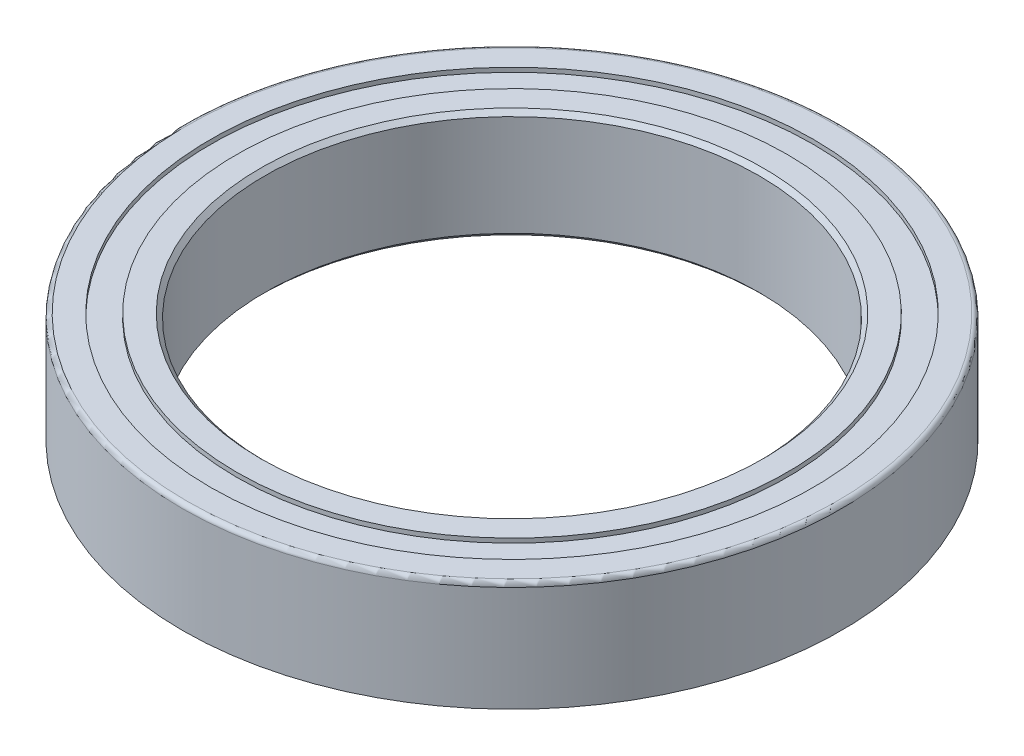
ISO-10303-21;
HEADER;
FILE_DESCRIPTION(('STEP AP214'),'2;1');
FILE_NAME('part.step','',(''),(''),'','','');
FILE_SCHEMA(('AUTOMOTIVE_DESIGN { 1 0 10303 214 1 1 1 1 }'));
ENDSEC;
DATA;
#1=APPLICATION_CONTEXT('core data for automotive mechanical design processes');
#2=APPLICATION_PROTOCOL_DEFINITION('international standard','automotive_design',2000,#1);
#3=PRODUCT_CONTEXT('',#1,'mechanical');
#4=PRODUCT('Part','Part','',(#3));
#5=PRODUCT_RELATED_PRODUCT_CATEGORY('part','',(#4));
#6=PRODUCT_DEFINITION_FORMATION('','',#4);
#7=PRODUCT_DEFINITION_CONTEXT('part definition',#1,'design');
#8=PRODUCT_DEFINITION('design','',#6,#7);
#9=PRODUCT_DEFINITION_SHAPE('','',#8);
#10=(LENGTH_UNIT() NAMED_UNIT(*) SI_UNIT(.MILLI.,.METRE.));
#11=(NAMED_UNIT(*) PLANE_ANGLE_UNIT() SI_UNIT($,.RADIAN.));
#12=(NAMED_UNIT(*) SI_UNIT($,.STERADIAN.) SOLID_ANGLE_UNIT());
#13=UNCERTAINTY_MEASURE_WITH_UNIT(LENGTH_MEASURE(1.E-05),#10,'distance_accuracy_value','');
#14=(GEOMETRIC_REPRESENTATION_CONTEXT(3) GLOBAL_UNCERTAINTY_ASSIGNED_CONTEXT((#13)) GLOBAL_UNIT_ASSIGNED_CONTEXT((#10,
#11,#12)) REPRESENTATION_CONTEXT('',''));
#15=CARTESIAN_POINT('',(0.,0.,0.));
#16=DIRECTION('',(0.,0.,1.));
#17=DIRECTION('',(1.,0.,0.));
#18=AXIS2_PLACEMENT_3D('',#15,#16,#17);
#19=CARTESIAN_POINT('',(0.,1.5875,0.));
#20=DIRECTION('',(0.,-1.,0.));
#21=DIRECTION('',(0.,0.,-1.));
#22=AXIS2_PLACEMENT_3D('',#19,#20,#21);
#23=CYLINDRICAL_SURFACE('',#22,8.7122);
#24=CARTESIAN_POINT('',(0.,-1.5875,0.));
#25=DIRECTION('',(0.,1.,0.));
#26=DIRECTION('',(0.,0.,1.));
#27=AXIS2_PLACEMENT_3D('',#24,#25,#26);
#28=CIRCLE('',#27,8.7122);
#29=CARTESIAN_POINT('',(0.,-1.5875,8.7122));
#30=VERTEX_POINT('',#29);
#31=EDGE_CURVE('E75',#30,#30,#28,.T.);
#32=ORIENTED_EDGE('',*,*,#31,.F.);
#33=EDGE_LOOP('',(#32));
#34=FACE_BOUND('',#33,.T.);
#35=CARTESIAN_POINT('',(0.,-1.4605,0.));
#36=DIRECTION('',(0.,1.,0.));
#37=DIRECTION('',(0.,0.,1.));
#38=AXIS2_PLACEMENT_3D('',#35,#36,#37);
#39=CIRCLE('',#38,8.7122);
#40=CARTESIAN_POINT('',(0.,-1.4605,8.7122));
#41=VERTEX_POINT('',#40);
#42=EDGE_CURVE('E78',#41,#41,#39,.T.);
#43=ORIENTED_EDGE('',*,*,#42,.T.);
#44=EDGE_LOOP('',(#43));
#45=FACE_BOUND('',#44,.T.);
#46=ADVANCED_FACE('F54',(#34,#45),#23,.F.);
#47=CARTESIAN_POINT('',(0.,1.4605,0.));
#48=DIRECTION('',(0.,1.,0.));
#49=DIRECTION('',(0.,0.,1.));
#50=AXIS2_PLACEMENT_3D('',#47,#48,#49);
#51=CIRCLE('',#50,8.7122);
#52=CARTESIAN_POINT('',(0.,1.4605,8.7122));
#53=VERTEX_POINT('',#52);
#54=EDGE_CURVE('E11',#53,#53,#51,.T.);
#55=ORIENTED_EDGE('',*,*,#54,.F.);
#56=EDGE_LOOP('',(#55));
#57=FACE_BOUND('',#56,.T.);
#58=CARTESIAN_POINT('',(0.,1.5875,0.));
#59=DIRECTION('',(0.,1.,0.));
#60=DIRECTION('',(0.,0.,1.));
#61=AXIS2_PLACEMENT_3D('',#58,#59,#60);
#62=CIRCLE('',#61,8.7122);
#63=CARTESIAN_POINT('',(0.,1.5875,8.7122));
#64=VERTEX_POINT('',#63);
#65=EDGE_CURVE('E69',#64,#64,#62,.T.);
#66=ORIENTED_EDGE('',*,*,#65,.T.);
#67=EDGE_LOOP('',(#66));
#68=FACE_BOUND('',#67,.T.);
#69=ADVANCED_FACE('F130',(#57,#68),#23,.F.);
#70=CARTESIAN_POINT('',(0.,1.5875,0.));
#71=DIRECTION('',(0.,-1.,0.));
#72=DIRECTION('',(0.,0.,-1.));
#73=AXIS2_PLACEMENT_3D('',#70,#71,#72);
#74=CYLINDRICAL_SURFACE('',#73,9.525);
#75=CARTESIAN_POINT('',(0.,1.4605,0.));
#76=DIRECTION('',(0.,1.,0.));
#77=DIRECTION('',(0.,0.,1.));
#78=AXIS2_PLACEMENT_3D('',#75,#76,#77);
#79=CIRCLE('',#78,9.525);
#80=CARTESIAN_POINT('',(0.,1.4605,9.525));
#81=VERTEX_POINT('',#80);
#82=EDGE_CURVE('E61',#81,#81,#79,.F.);
#83=ORIENTED_EDGE('',*,*,#82,.T.);
#84=EDGE_LOOP('',(#83));
#85=FACE_BOUND('',#84,.T.);
#86=CARTESIAN_POINT('',(0.,-1.5875,0.));
#87=DIRECTION('',(0.,1.,0.));
#88=DIRECTION('',(0.,0.,1.));
#89=AXIS2_PLACEMENT_3D('',#86,#87,#88);
#90=CIRCLE('',#89,9.525);
#91=CARTESIAN_POINT('',(0.,-1.5875,9.525));
#92=VERTEX_POINT('',#91);
#93=EDGE_CURVE('E72',#92,#92,#90,.T.);
#94=ORIENTED_EDGE('',*,*,#93,.T.);
#95=EDGE_LOOP('',(#94));
#96=FACE_BOUND('',#95,.T.);
#97=ADVANCED_FACE('F136',(#85,#96),#74,.T.);
#98=CARTESIAN_POINT('',(0.,1.5875,0.));
#99=DIRECTION('',(0.,1.,0.));
#100=DIRECTION('',(0.,0.,1.));
#101=AXIS2_PLACEMENT_3D('',#98,#99,#100);
#102=PLANE('',#101);
#103=CARTESIAN_POINT('',(0.,1.5875,0.));
#104=DIRECTION('',(0.,1.,0.));
#105=DIRECTION('',(0.,0.,1.));
#106=AXIS2_PLACEMENT_3D('',#103,#104,#105);
#107=CIRCLE('',#106,9.398);
#108=CARTESIAN_POINT('',(0.,1.5875,9.398));
#109=VERTEX_POINT('',#108);
#110=EDGE_CURVE('E65',#109,#109,#107,.T.);
#111=ORIENTED_EDGE('',*,*,#110,.T.);
#112=EDGE_LOOP('',(#111));
#113=FACE_BOUND('',#112,.T.);
#114=ORIENTED_EDGE('',*,*,#65,.F.);
#115=EDGE_LOOP('',(#114));
#116=FACE_BOUND('',#115,.T.);
#117=ADVANCED_FACE('F143',(#113,#116),#102,.T.);
#118=CARTESIAN_POINT('',(0.,-1.5875,0.));
#119=DIRECTION('',(0.,1.,0.));
#120=DIRECTION('',(0.,0.,1.));
#121=AXIS2_PLACEMENT_3D('',#118,#119,#120);
#122=PLANE('',#121);
#123=ORIENTED_EDGE('',*,*,#31,.T.);
#124=EDGE_LOOP('',(#123));
#125=FACE_BOUND('',#124,.T.);
#126=ORIENTED_EDGE('',*,*,#93,.F.);
#127=EDGE_LOOP('',(#126));
#128=FACE_BOUND('',#127,.T.);
#129=ADVANCED_FACE('F144',(#125,#128),#122,.F.);
#130=CARTESIAN_POINT('',(0.,1.4605,0.));
#131=DIRECTION('',(0.,1.,0.));
#132=DIRECTION('',(0.,0.,1.));
#133=AXIS2_PLACEMENT_3D('',#130,#131,#132);
#134=TOROIDAL_SURFACE('',#133,9.398,0.127);
#135=ORIENTED_EDGE('',*,*,#82,.F.);
#136=EDGE_LOOP('',(#135));
#137=FACE_BOUND('',#136,.T.);
#138=ORIENTED_EDGE('',*,*,#110,.F.);
#139=EDGE_LOOP('',(#138));
#140=FACE_BOUND('',#139,.T.);
#141=ADVANCED_FACE('F56',(#137,#140),#134,.T.);
#142=CARTESIAN_POINT('',(0.,1.4605,0.));
#143=DIRECTION('',(0.,1.,0.));
#144=DIRECTION('',(0.,0.,1.));
#145=AXIS2_PLACEMENT_3D('',#142,#143,#144);
#146=PLANE('',#145);
#147=ORIENTED_EDGE('',*,*,#54,.T.);
#148=EDGE_LOOP('',(#147));
#149=FACE_BOUND('',#148,.T.);
#150=CARTESIAN_POINT('',(0.,1.4605,0.));
#151=DIRECTION('',(0.,1.,0.));
#152=DIRECTION('',(0.,0.,1.));
#153=AXIS2_PLACEMENT_3D('',#150,#151,#152);
#154=CIRCLE('',#153,7.95655);
#155=CARTESIAN_POINT('',(0.,1.4605,7.95655));
#156=VERTEX_POINT('',#155);
#157=EDGE_CURVE('E83',#156,#156,#154,.T.);
#158=ORIENTED_EDGE('',*,*,#157,.F.);
#159=EDGE_LOOP('',(#158));
#160=FACE_BOUND('',#159,.T.);
#161=ADVANCED_FACE('F153',(#149,#160),#146,.T.);
#162=CARTESIAN_POINT('',(0.,-1.4605,0.));
#163=DIRECTION('',(0.,1.,0.));
#164=DIRECTION('',(0.,0.,1.));
#165=AXIS2_PLACEMENT_3D('',#162,#163,#164);
#166=PLANE('',#165);
#167=ORIENTED_EDGE('',*,*,#42,.F.);
#168=EDGE_LOOP('',(#167));
#169=FACE_BOUND('',#168,.T.);
#170=CARTESIAN_POINT('',(0.,-1.4605,0.));
#171=DIRECTION('',(0.,1.,0.));
#172=DIRECTION('',(0.,0.,1.));
#173=AXIS2_PLACEMENT_3D('',#170,#171,#172);
#174=CIRCLE('',#173,7.95655);
#175=CARTESIAN_POINT('',(0.,-1.4605,7.95655));
#176=VERTEX_POINT('',#175);
#177=EDGE_CURVE('E86',#176,#176,#174,.F.);
#178=ORIENTED_EDGE('',*,*,#177,.F.);
#179=EDGE_LOOP('',(#178));
#180=FACE_BOUND('',#179,.T.);
#181=ADVANCED_FACE('F127',(#169,#180),#166,.F.);
#182=CARTESIAN_POINT('',(0.,1.5875,0.));
#183=DIRECTION('',(0.,-1.,0.));
#184=DIRECTION('',(0.,0.,-1.));
#185=AXIS2_PLACEMENT_3D('',#182,#183,#184);
#186=CYLINDRICAL_SURFACE('',#185,7.95655);
#187=CARTESIAN_POINT('',(0.,-1.5875,0.));
#188=DIRECTION('',(0.,1.,0.));
#189=DIRECTION('',(0.,0.,1.));
#190=AXIS2_PLACEMENT_3D('',#187,#188,#189);
#191=CIRCLE('',#190,7.95655);
#192=CARTESIAN_POINT('',(0.,-1.5875,7.95655));
#193=VERTEX_POINT('',#192);
#194=EDGE_CURVE('E102',#193,#193,#191,.T.);
#195=ORIENTED_EDGE('',*,*,#194,.T.);
#196=EDGE_LOOP('',(#195));
#197=FACE_BOUND('',#196,.T.);
#198=ORIENTED_EDGE('',*,*,#177,.T.);
#199=EDGE_LOOP('',(#198));
#200=FACE_BOUND('',#199,.T.);
#201=ADVANCED_FACE('F115',(#197,#200),#186,.T.);
#202=CARTESIAN_POINT('',(0.,1.5875,0.));
#203=DIRECTION('',(0.,-1.,0.));
#204=DIRECTION('',(0.,0.,-1.));
#205=AXIS2_PLACEMENT_3D('',#202,#203,#204);
#206=CYLINDRICAL_SURFACE('',#205,7.14375);
#207=CARTESIAN_POINT('',(0.,-1.4605,0.));
#208=DIRECTION('',(0.,1.,0.));
#209=DIRECTION('',(0.,0.,1.));
#210=AXIS2_PLACEMENT_3D('',#207,#208,#209);
#211=CIRCLE('',#210,7.14375);
#212=CARTESIAN_POINT('',(0.,-1.4605,7.14375));
#213=VERTEX_POINT('',#212);
#214=EDGE_CURVE('E92',#213,#213,#211,.F.);
#215=ORIENTED_EDGE('',*,*,#214,.T.);
#216=EDGE_LOOP('',(#215));
#217=FACE_BOUND('',#216,.T.);
#218=CARTESIAN_POINT('',(0.,1.4605,0.));
#219=DIRECTION('',(0.,1.,0.));
#220=DIRECTION('',(0.,0.,1.));
#221=AXIS2_PLACEMENT_3D('',#218,#219,#220);
#222=CIRCLE('',#221,7.14375);
#223=CARTESIAN_POINT('',(0.,1.4605,7.14375));
#224=VERTEX_POINT('',#223);
#225=EDGE_CURVE('E95',#224,#224,#222,.T.);
#226=ORIENTED_EDGE('',*,*,#225,.T.);
#227=EDGE_LOOP('',(#226));
#228=FACE_BOUND('',#227,.T.);
#229=ADVANCED_FACE('F112',(#217,#228),#206,.F.);
#230=ORIENTED_EDGE('',*,*,#157,.T.);
#231=EDGE_LOOP('',(#230));
#232=FACE_BOUND('',#231,.T.);
#233=CARTESIAN_POINT('',(0.,1.5875,0.));
#234=DIRECTION('',(0.,1.,0.));
#235=DIRECTION('',(0.,0.,1.));
#236=AXIS2_PLACEMENT_3D('',#233,#234,#235);
#237=CIRCLE('',#236,7.95655);
#238=CARTESIAN_POINT('',(0.,1.5875,7.95655));
#239=VERTEX_POINT('',#238);
#240=EDGE_CURVE('E101',#239,#239,#237,.T.);
#241=ORIENTED_EDGE('',*,*,#240,.F.);
#242=EDGE_LOOP('',(#241));
#243=FACE_BOUND('',#242,.T.);
#244=ADVANCED_FACE('F110',(#232,#243),#186,.T.);
#245=CARTESIAN_POINT('',(0.,1.5875,0.));
#246=DIRECTION('',(0.,1.,0.));
#247=DIRECTION('',(0.,0.,1.));
#248=AXIS2_PLACEMENT_3D('',#245,#246,#247);
#249=PLANE('',#248);
#250=CARTESIAN_POINT('',(0.,1.5875,0.));
#251=DIRECTION('',(0.,1.,0.));
#252=DIRECTION('',(0.,0.,1.));
#253=AXIS2_PLACEMENT_3D('',#250,#251,#252);
#254=CIRCLE('',#253,7.27075);
#255=CARTESIAN_POINT('',(0.,1.5875,7.27075));
#256=VERTEX_POINT('',#255);
#257=EDGE_CURVE('E89',#256,#256,#254,.F.);
#258=ORIENTED_EDGE('',*,*,#257,.T.);
#259=EDGE_LOOP('',(#258));
#260=FACE_BOUND('',#259,.T.);
#261=ORIENTED_EDGE('',*,*,#240,.T.);
#262=EDGE_LOOP('',(#261));
#263=FACE_BOUND('',#262,.T.);
#264=ADVANCED_FACE('F108',(#260,#263),#249,.T.);
#265=CARTESIAN_POINT('',(0.,-1.5875,0.));
#266=DIRECTION('',(0.,1.,0.));
#267=DIRECTION('',(0.,0.,1.));
#268=AXIS2_PLACEMENT_3D('',#265,#266,#267);
#269=PLANE('',#268);
#270=CARTESIAN_POINT('',(0.,-1.5875,0.));
#271=DIRECTION('',(0.,1.,0.));
#272=DIRECTION('',(0.,0.,1.));
#273=AXIS2_PLACEMENT_3D('',#270,#271,#272);
#274=CIRCLE('',#273,7.27075);
#275=CARTESIAN_POINT('',(0.,-1.5875,7.27075));
#276=VERTEX_POINT('',#275);
#277=EDGE_CURVE('E98',#276,#276,#274,.T.);
#278=ORIENTED_EDGE('',*,*,#277,.T.);
#279=EDGE_LOOP('',(#278));
#280=FACE_BOUND('',#279,.T.);
#281=ORIENTED_EDGE('',*,*,#194,.F.);
#282=EDGE_LOOP('',(#281));
#283=FACE_BOUND('',#282,.T.);
#284=ADVANCED_FACE('F120',(#280,#283),#269,.F.);
#285=CARTESIAN_POINT('',(0.,-1.5875,0.));
#286=DIRECTION('',(0.,-1.,0.));
#287=DIRECTION('',(0.,0.,-1.));
#288=AXIS2_PLACEMENT_3D('',#285,#286,#287);
#289=CONICAL_SURFACE('',#288,7.27075,0.785398163397448);
#290=ORIENTED_EDGE('',*,*,#214,.F.);
#291=EDGE_LOOP('',(#290));
#292=FACE_BOUND('',#291,.T.);
#293=ORIENTED_EDGE('',*,*,#277,.F.);
#294=EDGE_LOOP('',(#293));
#295=FACE_BOUND('',#294,.T.);
#296=ADVANCED_FACE('F164',(#292,#295),#289,.F.);
#297=CARTESIAN_POINT('',(0.,1.4605,0.));
#298=DIRECTION('',(0.,1.,0.));
#299=DIRECTION('',(0.,0.,1.));
#300=AXIS2_PLACEMENT_3D('',#297,#298,#299);
#301=CONICAL_SURFACE('',#300,7.14375,0.785398163397448);
#302=ORIENTED_EDGE('',*,*,#257,.F.);
#303=EDGE_LOOP('',(#302));
#304=FACE_BOUND('',#303,.T.);
#305=ORIENTED_EDGE('',*,*,#225,.F.);
#306=EDGE_LOOP('',(#305));
#307=FACE_BOUND('',#306,.T.);
#308=ADVANCED_FACE('F158',(#304,#307),#301,.F.);
#309=CLOSED_SHELL('',(#46,#69,#97,#117,#129,#141,#161,#181,#201,#229,#244,#264,#284,#296,#308));
#310=MANIFOLD_SOLID_BREP('B2',#309);
#311=ADVANCED_BREP_SHAPE_REPRESENTATION('',(#18,#310),#14);
#312=SHAPE_DEFINITION_REPRESENTATION(#9,#311);
ENDSEC;
END-ISO-10303-21;
